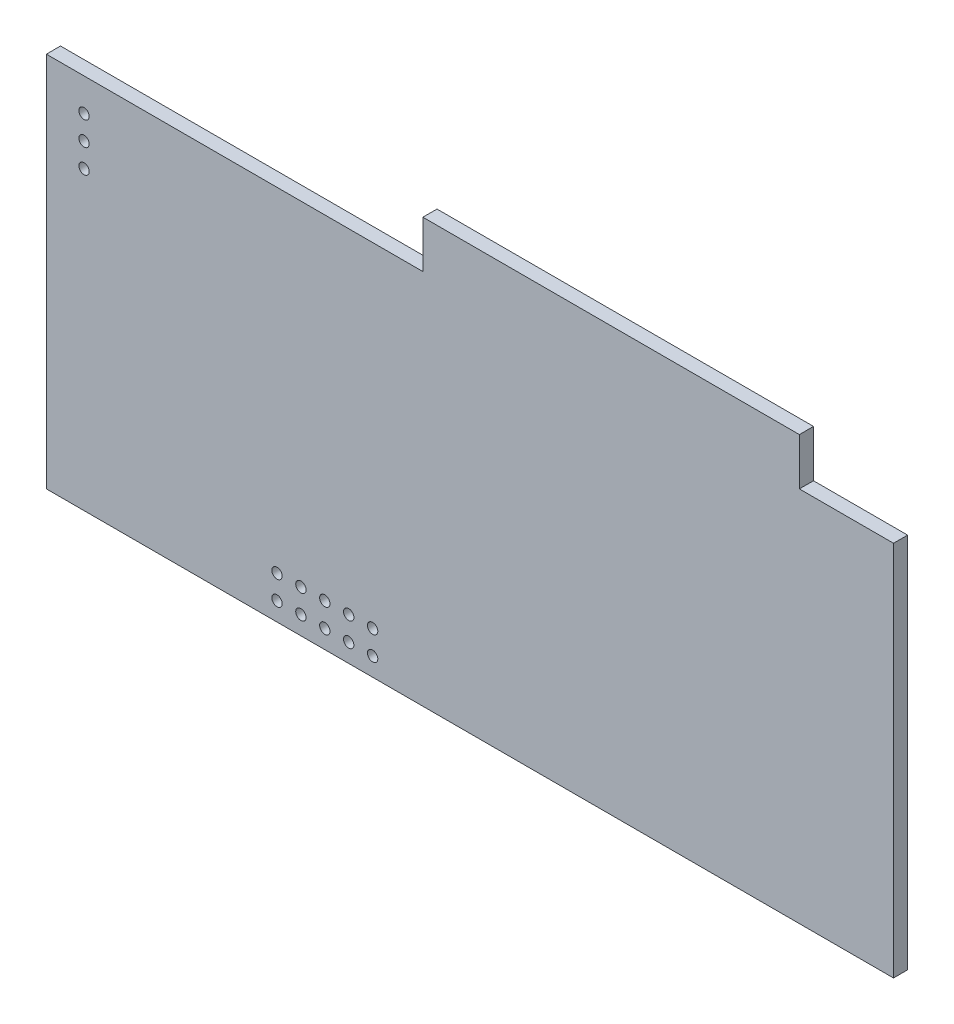
ISO-10303-21;
HEADER;
FILE_DESCRIPTION(('STEP AP214'),'2;1');
FILE_NAME('part.step','',(''),(''),'','','');
FILE_SCHEMA(('AUTOMOTIVE_DESIGN { 1 0 10303 214 1 1 1 1 }'));
ENDSEC;
DATA;
#1=APPLICATION_CONTEXT('core data for automotive mechanical design processes');
#2=APPLICATION_PROTOCOL_DEFINITION('international standard','automotive_design',2000,#1);
#3=PRODUCT_CONTEXT('',#1,'mechanical');
#4=PRODUCT('Part','Part','',(#3));
#5=PRODUCT_RELATED_PRODUCT_CATEGORY('part','',(#4));
#6=PRODUCT_DEFINITION_FORMATION('','',#4);
#7=PRODUCT_DEFINITION_CONTEXT('part definition',#1,'design');
#8=PRODUCT_DEFINITION('design','',#6,#7);
#9=PRODUCT_DEFINITION_SHAPE('','',#8);
#10=(LENGTH_UNIT() NAMED_UNIT(*) SI_UNIT(.MILLI.,.METRE.));
#11=(NAMED_UNIT(*) PLANE_ANGLE_UNIT() SI_UNIT($,.RADIAN.));
#12=(NAMED_UNIT(*) SI_UNIT($,.STERADIAN.) SOLID_ANGLE_UNIT());
#13=UNCERTAINTY_MEASURE_WITH_UNIT(LENGTH_MEASURE(1.E-05),#10,'distance_accuracy_value','');
#14=(GEOMETRIC_REPRESENTATION_CONTEXT(3) GLOBAL_UNCERTAINTY_ASSIGNED_CONTEXT((#13)) GLOBAL_UNIT_ASSIGNED_CONTEXT((#10,
#11,#12)) REPRESENTATION_CONTEXT('',''));
#15=CARTESIAN_POINT('',(0.,0.,0.));
#16=DIRECTION('',(0.,0.,1.));
#17=DIRECTION('',(1.,0.,0.));
#18=AXIS2_PLACEMENT_3D('',#15,#16,#17);
#19=CARTESIAN_POINT('',(-40.,-20.,1.5));
#20=DIRECTION('',(1.,0.,0.));
#21=DIRECTION('',(0.,0.,-1.));
#22=AXIS2_PLACEMENT_3D('',#19,#20,#21);
#23=PLANE('',#22);
#24=DIRECTION('',(0.,-1.,0.));
#25=VECTOR('',#24,1.);
#26=CARTESIAN_POINT('',(-40.,-20.,0.));
#27=LINE('',#26,#25);
#28=CARTESIAN_POINT('',(-40.,20.,0.));
#29=VERTEX_POINT('',#28);
#30=CARTESIAN_POINT('',(-40.,-20.,0.));
#31=VERTEX_POINT('',#30);
#32=EDGE_CURVE('E127',#29,#31,#27,.T.);
#33=ORIENTED_EDGE('',*,*,#32,.T.);
#34=DIRECTION('',(0.,0.,-1.));
#35=VECTOR('',#34,1.);
#36=CARTESIAN_POINT('',(-40.,-20.,1.5));
#37=LINE('',#36,#35);
#38=CARTESIAN_POINT('',(-40.,-20.,1.5));
#39=VERTEX_POINT('',#38);
#40=EDGE_CURVE('E11',#39,#31,#37,.T.);
#41=ORIENTED_EDGE('',*,*,#40,.F.);
#42=DIRECTION('',(0.,-1.,0.));
#43=VECTOR('',#42,1.);
#44=CARTESIAN_POINT('',(-40.,-20.,1.5));
#45=LINE('',#44,#43);
#46=CARTESIAN_POINT('',(-40.,20.,1.5));
#47=VERTEX_POINT('',#46);
#48=EDGE_CURVE('E142',#47,#39,#45,.T.);
#49=ORIENTED_EDGE('',*,*,#48,.F.);
#50=DIRECTION('',(0.,0.,-1.));
#51=VECTOR('',#50,1.);
#52=CARTESIAN_POINT('',(-40.,20.,1.5));
#53=LINE('',#52,#51);
#54=EDGE_CURVE('E123',#47,#29,#53,.T.);
#55=ORIENTED_EDGE('',*,*,#54,.T.);
#56=EDGE_LOOP('',(#33,#41,#49,#55));
#57=FACE_BOUND('',#56,.T.);
#58=ADVANCED_FACE('F31',(#57),#23,.F.);
#59=CARTESIAN_POINT('',(-40.,-20.,1.5));
#60=DIRECTION('',(0.,1.,0.));
#61=DIRECTION('',(0.,0.,1.));
#62=AXIS2_PLACEMENT_3D('',#59,#60,#61);
#63=PLANE('',#62);
#64=DIRECTION('',(1.,0.,0.));
#65=VECTOR('',#64,1.);
#66=CARTESIAN_POINT('',(-40.,-20.,0.));
#67=LINE('',#66,#65);
#68=CARTESIAN_POINT('',(50.,-20.,0.));
#69=VERTEX_POINT('',#68);
#70=EDGE_CURVE('E130',#31,#69,#67,.T.);
#71=ORIENTED_EDGE('',*,*,#70,.T.);
#72=DIRECTION('',(0.,0.,-1.));
#73=VECTOR('',#72,1.);
#74=CARTESIAN_POINT('',(50.,-20.,1.5));
#75=LINE('',#74,#73);
#76=CARTESIAN_POINT('',(50.,-20.,1.5));
#77=VERTEX_POINT('',#76);
#78=EDGE_CURVE('E39',#77,#69,#75,.T.);
#79=ORIENTED_EDGE('',*,*,#78,.F.);
#80=DIRECTION('',(1.,0.,0.));
#81=VECTOR('',#80,1.);
#82=CARTESIAN_POINT('',(-40.,-20.,1.5));
#83=LINE('',#82,#81);
#84=EDGE_CURVE('E90',#39,#77,#83,.T.);
#85=ORIENTED_EDGE('',*,*,#84,.F.);
#86=ORIENTED_EDGE('',*,*,#40,.T.);
#87=EDGE_LOOP('',(#71,#79,#85,#86));
#88=FACE_BOUND('',#87,.T.);
#89=ADVANCED_FACE('F305',(#88),#63,.F.);
#90=CARTESIAN_POINT('',(50.,-20.,1.5));
#91=DIRECTION('',(-1.,0.,0.));
#92=DIRECTION('',(0.,0.,1.));
#93=AXIS2_PLACEMENT_3D('',#90,#91,#92);
#94=PLANE('',#93);
#95=DIRECTION('',(0.,1.,0.));
#96=VECTOR('',#95,1.);
#97=CARTESIAN_POINT('',(50.,-20.,0.));
#98=LINE('',#97,#96);
#99=CARTESIAN_POINT('',(50.,20.,0.));
#100=VERTEX_POINT('',#99);
#101=EDGE_CURVE('E133',#69,#100,#98,.T.);
#102=ORIENTED_EDGE('',*,*,#101,.T.);
#103=DIRECTION('',(0.,0.,-1.));
#104=VECTOR('',#103,1.);
#105=CARTESIAN_POINT('',(50.,20.,1.5));
#106=LINE('',#105,#104);
#107=CARTESIAN_POINT('',(50.,20.,1.5));
#108=VERTEX_POINT('',#107);
#109=EDGE_CURVE('E149',#108,#100,#106,.T.);
#110=ORIENTED_EDGE('',*,*,#109,.F.);
#111=DIRECTION('',(0.,1.,0.));
#112=VECTOR('',#111,1.);
#113=CARTESIAN_POINT('',(50.,-20.,1.5));
#114=LINE('',#113,#112);
#115=EDGE_CURVE('E157',#77,#108,#114,.T.);
#116=ORIENTED_EDGE('',*,*,#115,.F.);
#117=ORIENTED_EDGE('',*,*,#78,.T.);
#118=EDGE_LOOP('',(#102,#110,#116,#117));
#119=FACE_BOUND('',#118,.T.);
#120=ADVANCED_FACE('F155',(#119),#94,.F.);
#121=CARTESIAN_POINT('',(40.,20.,1.5));
#122=DIRECTION('',(0.,-1.,0.));
#123=DIRECTION('',(0.,0.,-1.));
#124=AXIS2_PLACEMENT_3D('',#121,#122,#123);
#125=PLANE('',#124);
#126=DIRECTION('',(-1.,0.,0.));
#127=VECTOR('',#126,1.);
#128=CARTESIAN_POINT('',(40.,20.,0.));
#129=LINE('',#128,#127);
#130=CARTESIAN_POINT('',(40.,20.,0.));
#131=VERTEX_POINT('',#130);
#132=EDGE_CURVE('E135',#100,#131,#129,.T.);
#133=ORIENTED_EDGE('',*,*,#132,.T.);
#134=DIRECTION('',(0.,0.,-1.));
#135=VECTOR('',#134,1.);
#136=CARTESIAN_POINT('',(40.,20.,1.5));
#137=LINE('',#136,#135);
#138=CARTESIAN_POINT('',(40.,20.,1.5));
#139=VERTEX_POINT('',#138);
#140=EDGE_CURVE('E146',#139,#131,#137,.T.);
#141=ORIENTED_EDGE('',*,*,#140,.F.);
#142=DIRECTION('',(-1.,0.,0.));
#143=VECTOR('',#142,1.);
#144=CARTESIAN_POINT('',(40.,20.,1.5));
#145=LINE('',#144,#143);
#146=EDGE_CURVE('E169',#108,#139,#145,.T.);
#147=ORIENTED_EDGE('',*,*,#146,.F.);
#148=ORIENTED_EDGE('',*,*,#109,.T.);
#149=EDGE_LOOP('',(#133,#141,#147,#148));
#150=FACE_BOUND('',#149,.T.);
#151=ADVANCED_FACE('F165',(#150),#125,.F.);
#152=CARTESIAN_POINT('',(40.,25.,1.5));
#153=DIRECTION('',(-1.,0.,0.));
#154=DIRECTION('',(0.,0.,1.));
#155=AXIS2_PLACEMENT_3D('',#152,#153,#154);
#156=PLANE('',#155);
#157=DIRECTION('',(0.,1.,0.));
#158=VECTOR('',#157,1.);
#159=CARTESIAN_POINT('',(40.,25.,0.));
#160=LINE('',#159,#158);
#161=CARTESIAN_POINT('',(40.,25.,0.));
#162=VERTEX_POINT('',#161);
#163=EDGE_CURVE('E137',#131,#162,#160,.T.);
#164=ORIENTED_EDGE('',*,*,#163,.T.);
#165=DIRECTION('',(0.,0.,-1.));
#166=VECTOR('',#165,1.);
#167=CARTESIAN_POINT('',(40.,25.,1.5));
#168=LINE('',#167,#166);
#169=CARTESIAN_POINT('',(40.,25.,1.5));
#170=VERTEX_POINT('',#169);
#171=EDGE_CURVE('E118',#170,#162,#168,.T.);
#172=ORIENTED_EDGE('',*,*,#171,.F.);
#173=DIRECTION('',(0.,1.,0.));
#174=VECTOR('',#173,1.);
#175=CARTESIAN_POINT('',(40.,25.,1.5));
#176=LINE('',#175,#174);
#177=EDGE_CURVE('E109',#139,#170,#176,.T.);
#178=ORIENTED_EDGE('',*,*,#177,.F.);
#179=ORIENTED_EDGE('',*,*,#140,.T.);
#180=EDGE_LOOP('',(#164,#172,#178,#179));
#181=FACE_BOUND('',#180,.T.);
#182=ADVANCED_FACE('F168',(#181),#156,.F.);
#183=CARTESIAN_POINT('',(0.,25.,1.5));
#184=DIRECTION('',(0.,-1.,0.));
#185=DIRECTION('',(0.,0.,-1.));
#186=AXIS2_PLACEMENT_3D('',#183,#184,#185);
#187=PLANE('',#186);
#188=DIRECTION('',(-1.,0.,0.));
#189=VECTOR('',#188,1.);
#190=CARTESIAN_POINT('',(0.,25.,0.));
#191=LINE('',#190,#189);
#192=CARTESIAN_POINT('',(0.,25.,0.));
#193=VERTEX_POINT('',#192);
#194=EDGE_CURVE('E117',#162,#193,#191,.T.);
#195=ORIENTED_EDGE('',*,*,#194,.T.);
#196=DIRECTION('',(0.,0.,-1.));
#197=VECTOR('',#196,1.);
#198=CARTESIAN_POINT('',(0.,25.,1.5));
#199=LINE('',#198,#197);
#200=CARTESIAN_POINT('',(0.,25.,1.5));
#201=VERTEX_POINT('',#200);
#202=EDGE_CURVE('E114',#201,#193,#199,.T.);
#203=ORIENTED_EDGE('',*,*,#202,.F.);
#204=DIRECTION('',(-1.,0.,0.));
#205=VECTOR('',#204,1.);
#206=CARTESIAN_POINT('',(0.,25.,1.5));
#207=LINE('',#206,#205);
#208=EDGE_CURVE('E103',#170,#201,#207,.T.);
#209=ORIENTED_EDGE('',*,*,#208,.F.);
#210=ORIENTED_EDGE('',*,*,#171,.T.);
#211=EDGE_LOOP('',(#195,#203,#209,#210));
#212=FACE_BOUND('',#211,.T.);
#213=ADVANCED_FACE('F115',(#212),#187,.F.);
#214=CARTESIAN_POINT('',(0.,20.,1.5));
#215=DIRECTION('',(1.,0.,0.));
#216=DIRECTION('',(0.,0.,-1.));
#217=AXIS2_PLACEMENT_3D('',#214,#215,#216);
#218=PLANE('',#217);
#219=DIRECTION('',(0.,-1.,0.));
#220=VECTOR('',#219,1.);
#221=CARTESIAN_POINT('',(0.,20.,0.));
#222=LINE('',#221,#220);
#223=CARTESIAN_POINT('',(0.,20.,0.));
#224=VERTEX_POINT('',#223);
#225=EDGE_CURVE('E76',#193,#224,#222,.T.);
#226=ORIENTED_EDGE('',*,*,#225,.T.);
#227=DIRECTION('',(0.,0.,-1.));
#228=VECTOR('',#227,1.);
#229=CARTESIAN_POINT('',(0.,20.,1.5));
#230=LINE('',#229,#228);
#231=CARTESIAN_POINT('',(0.,20.,1.5));
#232=VERTEX_POINT('',#231);
#233=EDGE_CURVE('E119',#232,#224,#230,.T.);
#234=ORIENTED_EDGE('',*,*,#233,.F.);
#235=DIRECTION('',(0.,-1.,0.));
#236=VECTOR('',#235,1.);
#237=CARTESIAN_POINT('',(0.,20.,1.5));
#238=LINE('',#237,#236);
#239=EDGE_CURVE('E107',#201,#232,#238,.T.);
#240=ORIENTED_EDGE('',*,*,#239,.F.);
#241=ORIENTED_EDGE('',*,*,#202,.T.);
#242=EDGE_LOOP('',(#226,#234,#240,#241));
#243=FACE_BOUND('',#242,.T.);
#244=ADVANCED_FACE('F121',(#243),#218,.F.);
#245=CARTESIAN_POINT('',(-40.,20.,1.5));
#246=DIRECTION('',(0.,-1.,0.));
#247=DIRECTION('',(0.,0.,-1.));
#248=AXIS2_PLACEMENT_3D('',#245,#246,#247);
#249=PLANE('',#248);
#250=DIRECTION('',(-1.,0.,0.));
#251=VECTOR('',#250,1.);
#252=CARTESIAN_POINT('',(-40.,20.,0.));
#253=LINE('',#252,#251);
#254=EDGE_CURVE('E82',#224,#29,#253,.T.);
#255=ORIENTED_EDGE('',*,*,#254,.T.);
#256=ORIENTED_EDGE('',*,*,#54,.F.);
#257=DIRECTION('',(-1.,0.,0.));
#258=VECTOR('',#257,1.);
#259=CARTESIAN_POINT('',(-40.,20.,1.5));
#260=LINE('',#259,#258);
#261=EDGE_CURVE('E47',#232,#47,#260,.T.);
#262=ORIENTED_EDGE('',*,*,#261,.F.);
#263=ORIENTED_EDGE('',*,*,#233,.T.);
#264=EDGE_LOOP('',(#255,#256,#262,#263));
#265=FACE_BOUND('',#264,.T.);
#266=ADVANCED_FACE('F264',(#265),#249,.F.);
#267=CARTESIAN_POINT('',(-40.,20.,1.5));
#268=DIRECTION('',(0.,0.,-1.));
#269=DIRECTION('',(-1.,0.,0.));
#270=AXIS2_PLACEMENT_3D('',#267,#268,#269);
#271=PLANE('',#270);
#272=CARTESIAN_POINT('',(-5.34,-18.04,1.5));
#273=DIRECTION('',(0.,0.,1.));
#274=DIRECTION('',(1.,0.,0.));
#275=AXIS2_PLACEMENT_3D('',#272,#273,#274);
#276=CIRCLE('',#275,0.549999999999999);
#277=CARTESIAN_POINT('',(-4.79,-18.04,1.5));
#278=VERTEX_POINT('',#277);
#279=EDGE_CURVE('E247',#278,#278,#276,.T.);
#280=ORIENTED_EDGE('',*,*,#279,.F.);
#281=EDGE_LOOP('',(#280));
#282=FACE_BOUND('',#281,.T.);
#283=CARTESIAN_POINT('',(-5.34,-15.5,1.5));
#284=DIRECTION('',(0.,0.,1.));
#285=DIRECTION('',(1.,0.,0.));
#286=AXIS2_PLACEMENT_3D('',#283,#284,#285);
#287=CIRCLE('',#286,0.55);
#288=CARTESIAN_POINT('',(-4.79,-15.5,1.5));
#289=VERTEX_POINT('',#288);
#290=EDGE_CURVE('E241',#289,#289,#287,.T.);
#291=ORIENTED_EDGE('',*,*,#290,.F.);
#292=EDGE_LOOP('',(#291));
#293=FACE_BOUND('',#292,.T.);
#294=CARTESIAN_POINT('',(-7.88,-18.04,1.5));
#295=DIRECTION('',(0.,0.,1.));
#296=DIRECTION('',(1.,0.,0.));
#297=AXIS2_PLACEMENT_3D('',#294,#295,#296);
#298=CIRCLE('',#297,0.549999999999999);
#299=CARTESIAN_POINT('',(-7.33,-18.04,1.5));
#300=VERTEX_POINT('',#299);
#301=EDGE_CURVE('E235',#300,#300,#298,.T.);
#302=ORIENTED_EDGE('',*,*,#301,.F.);
#303=EDGE_LOOP('',(#302));
#304=FACE_BOUND('',#303,.T.);
#305=CARTESIAN_POINT('',(-7.88,-15.5,1.5));
#306=DIRECTION('',(0.,0.,1.));
#307=DIRECTION('',(1.,0.,0.));
#308=AXIS2_PLACEMENT_3D('',#305,#306,#307);
#309=CIRCLE('',#308,0.55);
#310=CARTESIAN_POINT('',(-7.33,-15.5,1.5));
#311=VERTEX_POINT('',#310);
#312=EDGE_CURVE('E229',#311,#311,#309,.T.);
#313=ORIENTED_EDGE('',*,*,#312,.F.);
#314=EDGE_LOOP('',(#313));
#315=FACE_BOUND('',#314,.T.);
#316=CARTESIAN_POINT('',(-10.42,-18.04,1.5));
#317=DIRECTION('',(0.,0.,1.));
#318=DIRECTION('',(1.,0.,0.));
#319=AXIS2_PLACEMENT_3D('',#316,#317,#318);
#320=CIRCLE('',#319,0.549999999999999);
#321=CARTESIAN_POINT('',(-9.87,-18.04,1.5));
#322=VERTEX_POINT('',#321);
#323=EDGE_CURVE('E223',#322,#322,#320,.T.);
#324=ORIENTED_EDGE('',*,*,#323,.F.);
#325=EDGE_LOOP('',(#324));
#326=FACE_BOUND('',#325,.T.);
#327=CARTESIAN_POINT('',(-10.42,-15.5,1.5));
#328=DIRECTION('',(0.,0.,1.));
#329=DIRECTION('',(1.,0.,0.));
#330=AXIS2_PLACEMENT_3D('',#327,#328,#329);
#331=CIRCLE('',#330,0.55);
#332=CARTESIAN_POINT('',(-9.87,-15.5,1.5));
#333=VERTEX_POINT('',#332);
#334=EDGE_CURVE('E217',#333,#333,#331,.T.);
#335=ORIENTED_EDGE('',*,*,#334,.F.);
#336=EDGE_LOOP('',(#335));
#337=FACE_BOUND('',#336,.T.);
#338=CARTESIAN_POINT('',(-12.96,-18.04,1.5));
#339=DIRECTION('',(0.,0.,1.));
#340=DIRECTION('',(1.,0.,0.));
#341=AXIS2_PLACEMENT_3D('',#338,#339,#340);
#342=CIRCLE('',#341,0.549999999999999);
#343=CARTESIAN_POINT('',(-12.41,-18.04,1.5));
#344=VERTEX_POINT('',#343);
#345=EDGE_CURVE('E211',#344,#344,#342,.T.);
#346=ORIENTED_EDGE('',*,*,#345,.F.);
#347=EDGE_LOOP('',(#346));
#348=FACE_BOUND('',#347,.T.);
#349=CARTESIAN_POINT('',(-12.96,-15.5,1.5));
#350=DIRECTION('',(0.,0.,1.));
#351=DIRECTION('',(1.,0.,0.));
#352=AXIS2_PLACEMENT_3D('',#349,#350,#351);
#353=CIRCLE('',#352,0.55);
#354=CARTESIAN_POINT('',(-12.41,-15.5,1.5));
#355=VERTEX_POINT('',#354);
#356=EDGE_CURVE('E205',#355,#355,#353,.T.);
#357=ORIENTED_EDGE('',*,*,#356,.F.);
#358=EDGE_LOOP('',(#357));
#359=FACE_BOUND('',#358,.T.);
#360=CARTESIAN_POINT('',(-15.5,-18.04,1.5));
#361=DIRECTION('',(0.,0.,1.));
#362=DIRECTION('',(1.,0.,0.));
#363=AXIS2_PLACEMENT_3D('',#360,#361,#362);
#364=CIRCLE('',#363,0.549999999999999);
#365=CARTESIAN_POINT('',(-14.95,-18.04,1.5));
#366=VERTEX_POINT('',#365);
#367=EDGE_CURVE('E199',#366,#366,#364,.T.);
#368=ORIENTED_EDGE('',*,*,#367,.F.);
#369=EDGE_LOOP('',(#368));
#370=FACE_BOUND('',#369,.T.);
#371=CARTESIAN_POINT('',(-15.5,-15.5,1.5));
#372=DIRECTION('',(0.,0.,1.));
#373=DIRECTION('',(1.,0.,0.));
#374=AXIS2_PLACEMENT_3D('',#371,#372,#373);
#375=CIRCLE('',#374,0.55);
#376=CARTESIAN_POINT('',(-14.95,-15.5,1.5));
#377=VERTEX_POINT('',#376);
#378=EDGE_CURVE('E193',#377,#377,#375,.T.);
#379=ORIENTED_EDGE('',*,*,#378,.F.);
#380=EDGE_LOOP('',(#379));
#381=FACE_BOUND('',#380,.T.);
#382=CARTESIAN_POINT('',(-36.,14.,1.5));
#383=DIRECTION('',(0.,0.,1.));
#384=DIRECTION('',(1.,0.,0.));
#385=AXIS2_PLACEMENT_3D('',#382,#383,#384);
#386=CIRCLE('',#385,0.550000000000003);
#387=CARTESIAN_POINT('',(-35.45,14.,1.5));
#388=VERTEX_POINT('',#387);
#389=EDGE_CURVE('E187',#388,#388,#386,.T.);
#390=ORIENTED_EDGE('',*,*,#389,.F.);
#391=EDGE_LOOP('',(#390));
#392=FACE_BOUND('',#391,.T.);
#393=CARTESIAN_POINT('',(-36.,11.46,1.5));
#394=DIRECTION('',(0.,0.,1.));
#395=DIRECTION('',(1.,0.,0.));
#396=AXIS2_PLACEMENT_3D('',#393,#394,#395);
#397=CIRCLE('',#396,0.550000000000003);
#398=CARTESIAN_POINT('',(-35.45,11.46,1.5));
#399=VERTEX_POINT('',#398);
#400=EDGE_CURVE('E181',#399,#399,#397,.T.);
#401=ORIENTED_EDGE('',*,*,#400,.F.);
#402=EDGE_LOOP('',(#401));
#403=FACE_BOUND('',#402,.T.);
#404=CARTESIAN_POINT('',(-36.,16.54,1.5));
#405=DIRECTION('',(0.,0.,1.));
#406=DIRECTION('',(1.,0.,0.));
#407=AXIS2_PLACEMENT_3D('',#404,#405,#406);
#408=CIRCLE('',#407,0.550000000000003);
#409=CARTESIAN_POINT('',(-35.45,16.54,1.5));
#410=VERTEX_POINT('',#409);
#411=EDGE_CURVE('E175',#410,#410,#408,.T.);
#412=ORIENTED_EDGE('',*,*,#411,.F.);
#413=EDGE_LOOP('',(#412));
#414=FACE_BOUND('',#413,.T.);
#415=ORIENTED_EDGE('',*,*,#48,.T.);
#416=ORIENTED_EDGE('',*,*,#84,.T.);
#417=ORIENTED_EDGE('',*,*,#115,.T.);
#418=ORIENTED_EDGE('',*,*,#146,.T.);
#419=ORIENTED_EDGE('',*,*,#177,.T.);
#420=ORIENTED_EDGE('',*,*,#208,.T.);
#421=ORIENTED_EDGE('',*,*,#239,.T.);
#422=ORIENTED_EDGE('',*,*,#261,.T.);
#423=EDGE_LOOP('',(#415,#416,#417,#418,#419,#420,#421,#422));
#424=FACE_BOUND('',#423,.T.);
#425=ADVANCED_FACE('F105',(#282,#293,#304,#315,#326,#337,#348,#359,#370,#381,#392,#403,#414,
#424),#271,.F.);
#426=CARTESIAN_POINT('',(-40.,20.,0.));
#427=DIRECTION('',(0.,0.,-1.));
#428=DIRECTION('',(-1.,0.,0.));
#429=AXIS2_PLACEMENT_3D('',#426,#427,#428);
#430=PLANE('',#429);
#431=CARTESIAN_POINT('',(-5.34,-18.04,0.));
#432=DIRECTION('',(0.,0.,1.));
#433=DIRECTION('',(1.,0.,0.));
#434=AXIS2_PLACEMENT_3D('',#431,#432,#433);
#435=CIRCLE('',#434,0.549999999999999);
#436=CARTESIAN_POINT('',(-4.79,-18.04,0.));
#437=VERTEX_POINT('',#436);
#438=EDGE_CURVE('E244',#437,#437,#435,.T.);
#439=ORIENTED_EDGE('',*,*,#438,.T.);
#440=EDGE_LOOP('',(#439));
#441=FACE_BOUND('',#440,.T.);
#442=CARTESIAN_POINT('',(-5.34,-15.5,0.));
#443=DIRECTION('',(0.,0.,1.));
#444=DIRECTION('',(1.,0.,0.));
#445=AXIS2_PLACEMENT_3D('',#442,#443,#444);
#446=CIRCLE('',#445,0.55);
#447=CARTESIAN_POINT('',(-4.79,-15.5,0.));
#448=VERTEX_POINT('',#447);
#449=EDGE_CURVE('E238',#448,#448,#446,.T.);
#450=ORIENTED_EDGE('',*,*,#449,.T.);
#451=EDGE_LOOP('',(#450));
#452=FACE_BOUND('',#451,.T.);
#453=CARTESIAN_POINT('',(-7.88,-18.04,0.));
#454=DIRECTION('',(0.,0.,1.));
#455=DIRECTION('',(1.,0.,0.));
#456=AXIS2_PLACEMENT_3D('',#453,#454,#455);
#457=CIRCLE('',#456,0.549999999999999);
#458=CARTESIAN_POINT('',(-7.33,-18.04,0.));
#459=VERTEX_POINT('',#458);
#460=EDGE_CURVE('E232',#459,#459,#457,.T.);
#461=ORIENTED_EDGE('',*,*,#460,.T.);
#462=EDGE_LOOP('',(#461));
#463=FACE_BOUND('',#462,.T.);
#464=CARTESIAN_POINT('',(-7.88,-15.5,0.));
#465=DIRECTION('',(0.,0.,1.));
#466=DIRECTION('',(1.,0.,0.));
#467=AXIS2_PLACEMENT_3D('',#464,#465,#466);
#468=CIRCLE('',#467,0.55);
#469=CARTESIAN_POINT('',(-7.33,-15.5,0.));
#470=VERTEX_POINT('',#469);
#471=EDGE_CURVE('E226',#470,#470,#468,.T.);
#472=ORIENTED_EDGE('',*,*,#471,.T.);
#473=EDGE_LOOP('',(#472));
#474=FACE_BOUND('',#473,.T.);
#475=CARTESIAN_POINT('',(-10.42,-18.04,0.));
#476=DIRECTION('',(0.,0.,1.));
#477=DIRECTION('',(1.,0.,0.));
#478=AXIS2_PLACEMENT_3D('',#475,#476,#477);
#479=CIRCLE('',#478,0.549999999999999);
#480=CARTESIAN_POINT('',(-9.87,-18.04,0.));
#481=VERTEX_POINT('',#480);
#482=EDGE_CURVE('E220',#481,#481,#479,.T.);
#483=ORIENTED_EDGE('',*,*,#482,.T.);
#484=EDGE_LOOP('',(#483));
#485=FACE_BOUND('',#484,.T.);
#486=CARTESIAN_POINT('',(-10.42,-15.5,0.));
#487=DIRECTION('',(0.,0.,1.));
#488=DIRECTION('',(1.,0.,0.));
#489=AXIS2_PLACEMENT_3D('',#486,#487,#488);
#490=CIRCLE('',#489,0.55);
#491=CARTESIAN_POINT('',(-9.87,-15.5,0.));
#492=VERTEX_POINT('',#491);
#493=EDGE_CURVE('E214',#492,#492,#490,.T.);
#494=ORIENTED_EDGE('',*,*,#493,.T.);
#495=EDGE_LOOP('',(#494));
#496=FACE_BOUND('',#495,.T.);
#497=CARTESIAN_POINT('',(-12.96,-18.04,0.));
#498=DIRECTION('',(0.,0.,1.));
#499=DIRECTION('',(1.,0.,0.));
#500=AXIS2_PLACEMENT_3D('',#497,#498,#499);
#501=CIRCLE('',#500,0.549999999999999);
#502=CARTESIAN_POINT('',(-12.41,-18.04,0.));
#503=VERTEX_POINT('',#502);
#504=EDGE_CURVE('E208',#503,#503,#501,.T.);
#505=ORIENTED_EDGE('',*,*,#504,.T.);
#506=EDGE_LOOP('',(#505));
#507=FACE_BOUND('',#506,.T.);
#508=CARTESIAN_POINT('',(-12.96,-15.5,0.));
#509=DIRECTION('',(0.,0.,1.));
#510=DIRECTION('',(1.,0.,0.));
#511=AXIS2_PLACEMENT_3D('',#508,#509,#510);
#512=CIRCLE('',#511,0.55);
#513=CARTESIAN_POINT('',(-12.41,-15.5,0.));
#514=VERTEX_POINT('',#513);
#515=EDGE_CURVE('E202',#514,#514,#512,.T.);
#516=ORIENTED_EDGE('',*,*,#515,.T.);
#517=EDGE_LOOP('',(#516));
#518=FACE_BOUND('',#517,.T.);
#519=CARTESIAN_POINT('',(-15.5,-18.04,0.));
#520=DIRECTION('',(0.,0.,1.));
#521=DIRECTION('',(1.,0.,0.));
#522=AXIS2_PLACEMENT_3D('',#519,#520,#521);
#523=CIRCLE('',#522,0.549999999999999);
#524=CARTESIAN_POINT('',(-14.95,-18.04,0.));
#525=VERTEX_POINT('',#524);
#526=EDGE_CURVE('E196',#525,#525,#523,.T.);
#527=ORIENTED_EDGE('',*,*,#526,.T.);
#528=EDGE_LOOP('',(#527));
#529=FACE_BOUND('',#528,.T.);
#530=CARTESIAN_POINT('',(-15.5,-15.5,0.));
#531=DIRECTION('',(0.,0.,1.));
#532=DIRECTION('',(1.,0.,0.));
#533=AXIS2_PLACEMENT_3D('',#530,#531,#532);
#534=CIRCLE('',#533,0.55);
#535=CARTESIAN_POINT('',(-14.95,-15.5,0.));
#536=VERTEX_POINT('',#535);
#537=EDGE_CURVE('E190',#536,#536,#534,.T.);
#538=ORIENTED_EDGE('',*,*,#537,.T.);
#539=EDGE_LOOP('',(#538));
#540=FACE_BOUND('',#539,.T.);
#541=CARTESIAN_POINT('',(-36.,14.,0.));
#542=DIRECTION('',(0.,0.,1.));
#543=DIRECTION('',(1.,0.,0.));
#544=AXIS2_PLACEMENT_3D('',#541,#542,#543);
#545=CIRCLE('',#544,0.550000000000003);
#546=CARTESIAN_POINT('',(-35.45,14.,0.));
#547=VERTEX_POINT('',#546);
#548=EDGE_CURVE('E184',#547,#547,#545,.T.);
#549=ORIENTED_EDGE('',*,*,#548,.T.);
#550=EDGE_LOOP('',(#549));
#551=FACE_BOUND('',#550,.T.);
#552=CARTESIAN_POINT('',(-36.,11.46,0.));
#553=DIRECTION('',(0.,0.,1.));
#554=DIRECTION('',(1.,0.,0.));
#555=AXIS2_PLACEMENT_3D('',#552,#553,#554);
#556=CIRCLE('',#555,0.550000000000003);
#557=CARTESIAN_POINT('',(-35.45,11.46,0.));
#558=VERTEX_POINT('',#557);
#559=EDGE_CURVE('E178',#558,#558,#556,.T.);
#560=ORIENTED_EDGE('',*,*,#559,.T.);
#561=EDGE_LOOP('',(#560));
#562=FACE_BOUND('',#561,.T.);
#563=CARTESIAN_POINT('',(-36.,16.54,0.));
#564=DIRECTION('',(0.,0.,1.));
#565=DIRECTION('',(1.,0.,0.));
#566=AXIS2_PLACEMENT_3D('',#563,#564,#565);
#567=CIRCLE('',#566,0.550000000000003);
#568=CARTESIAN_POINT('',(-35.45,16.54,0.));
#569=VERTEX_POINT('',#568);
#570=EDGE_CURVE('E131',#569,#569,#567,.T.);
#571=ORIENTED_EDGE('',*,*,#570,.T.);
#572=EDGE_LOOP('',(#571));
#573=FACE_BOUND('',#572,.T.);
#574=ORIENTED_EDGE('',*,*,#32,.F.);
#575=ORIENTED_EDGE('',*,*,#254,.F.);
#576=ORIENTED_EDGE('',*,*,#225,.F.);
#577=ORIENTED_EDGE('',*,*,#194,.F.);
#578=ORIENTED_EDGE('',*,*,#163,.F.);
#579=ORIENTED_EDGE('',*,*,#132,.F.);
#580=ORIENTED_EDGE('',*,*,#101,.F.);
#581=ORIENTED_EDGE('',*,*,#70,.F.);
#582=EDGE_LOOP('',(#574,#575,#576,#577,#578,#579,#580,#581));
#583=FACE_BOUND('',#582,.T.);
#584=ADVANCED_FACE('F161',(#441,#452,#463,#474,#485,#496,#507,#518,#529,#540,#551,#562,#573,
#583),#430,.T.);
#585=CARTESIAN_POINT('',(-36.,16.54,0.));
#586=DIRECTION('',(0.,0.,1.));
#587=DIRECTION('',(1.,0.,0.));
#588=AXIS2_PLACEMENT_3D('',#585,#586,#587);
#589=CYLINDRICAL_SURFACE('',#588,0.550000000000003);
#590=ORIENTED_EDGE('',*,*,#570,.F.);
#591=EDGE_LOOP('',(#590));
#592=FACE_BOUND('',#591,.T.);
#593=ORIENTED_EDGE('',*,*,#411,.T.);
#594=EDGE_LOOP('',(#593));
#595=FACE_BOUND('',#594,.T.);
#596=ADVANCED_FACE('F290',(#592,#595),#589,.F.);
#597=CARTESIAN_POINT('',(-36.,11.46,0.));
#598=DIRECTION('',(0.,0.,1.));
#599=DIRECTION('',(1.,0.,0.));
#600=AXIS2_PLACEMENT_3D('',#597,#598,#599);
#601=CYLINDRICAL_SURFACE('',#600,0.550000000000003);
#602=ORIENTED_EDGE('',*,*,#559,.F.);
#603=EDGE_LOOP('',(#602));
#604=FACE_BOUND('',#603,.T.);
#605=ORIENTED_EDGE('',*,*,#400,.T.);
#606=EDGE_LOOP('',(#605));
#607=FACE_BOUND('',#606,.T.);
#608=ADVANCED_FACE('F292',(#604,#607),#601,.F.);
#609=CARTESIAN_POINT('',(-36.,14.,0.));
#610=DIRECTION('',(0.,0.,1.));
#611=DIRECTION('',(1.,0.,0.));
#612=AXIS2_PLACEMENT_3D('',#609,#610,#611);
#613=CYLINDRICAL_SURFACE('',#612,0.550000000000003);
#614=ORIENTED_EDGE('',*,*,#548,.F.);
#615=EDGE_LOOP('',(#614));
#616=FACE_BOUND('',#615,.T.);
#617=ORIENTED_EDGE('',*,*,#389,.T.);
#618=EDGE_LOOP('',(#617));
#619=FACE_BOUND('',#618,.T.);
#620=ADVANCED_FACE('F299',(#616,#619),#613,.F.);
#621=CARTESIAN_POINT('',(-15.5,-15.5,0.));
#622=DIRECTION('',(0.,0.,1.));
#623=DIRECTION('',(1.,0.,0.));
#624=AXIS2_PLACEMENT_3D('',#621,#622,#623);
#625=CYLINDRICAL_SURFACE('',#624,0.55);
#626=ORIENTED_EDGE('',*,*,#537,.F.);
#627=EDGE_LOOP('',(#626));
#628=FACE_BOUND('',#627,.T.);
#629=ORIENTED_EDGE('',*,*,#378,.T.);
#630=EDGE_LOOP('',(#629));
#631=FACE_BOUND('',#630,.T.);
#632=ADVANCED_FACE('F381',(#628,#631),#625,.F.);
#633=CARTESIAN_POINT('',(-15.5,-18.04,0.));
#634=DIRECTION('',(0.,0.,1.));
#635=DIRECTION('',(1.,0.,0.));
#636=AXIS2_PLACEMENT_3D('',#633,#634,#635);
#637=CYLINDRICAL_SURFACE('',#636,0.549999999999999);
#638=ORIENTED_EDGE('',*,*,#526,.F.);
#639=EDGE_LOOP('',(#638));
#640=FACE_BOUND('',#639,.T.);
#641=ORIENTED_EDGE('',*,*,#367,.T.);
#642=EDGE_LOOP('',(#641));
#643=FACE_BOUND('',#642,.T.);
#644=ADVANCED_FACE('F391',(#640,#643),#637,.F.);
#645=CARTESIAN_POINT('',(-12.96,-15.5,0.));
#646=DIRECTION('',(0.,0.,1.));
#647=DIRECTION('',(1.,0.,0.));
#648=AXIS2_PLACEMENT_3D('',#645,#646,#647);
#649=CYLINDRICAL_SURFACE('',#648,0.55);
#650=ORIENTED_EDGE('',*,*,#515,.F.);
#651=EDGE_LOOP('',(#650));
#652=FACE_BOUND('',#651,.T.);
#653=ORIENTED_EDGE('',*,*,#356,.T.);
#654=EDGE_LOOP('',(#653));
#655=FACE_BOUND('',#654,.T.);
#656=ADVANCED_FACE('F401',(#652,#655),#649,.F.);
#657=CARTESIAN_POINT('',(-12.96,-18.04,0.));
#658=DIRECTION('',(0.,0.,1.));
#659=DIRECTION('',(1.,0.,0.));
#660=AXIS2_PLACEMENT_3D('',#657,#658,#659);
#661=CYLINDRICAL_SURFACE('',#660,0.549999999999999);
#662=ORIENTED_EDGE('',*,*,#504,.F.);
#663=EDGE_LOOP('',(#662));
#664=FACE_BOUND('',#663,.T.);
#665=ORIENTED_EDGE('',*,*,#345,.T.);
#666=EDGE_LOOP('',(#665));
#667=FACE_BOUND('',#666,.T.);
#668=ADVANCED_FACE('F411',(#664,#667),#661,.F.);
#669=CARTESIAN_POINT('',(-10.42,-15.5,0.));
#670=DIRECTION('',(0.,0.,1.));
#671=DIRECTION('',(1.,0.,0.));
#672=AXIS2_PLACEMENT_3D('',#669,#670,#671);
#673=CYLINDRICAL_SURFACE('',#672,0.55);
#674=ORIENTED_EDGE('',*,*,#493,.F.);
#675=EDGE_LOOP('',(#674));
#676=FACE_BOUND('',#675,.T.);
#677=ORIENTED_EDGE('',*,*,#334,.T.);
#678=EDGE_LOOP('',(#677));
#679=FACE_BOUND('',#678,.T.);
#680=ADVANCED_FACE('F421',(#676,#679),#673,.F.);
#681=CARTESIAN_POINT('',(-10.42,-18.04,0.));
#682=DIRECTION('',(0.,0.,1.));
#683=DIRECTION('',(1.,0.,0.));
#684=AXIS2_PLACEMENT_3D('',#681,#682,#683);
#685=CYLINDRICAL_SURFACE('',#684,0.549999999999999);
#686=ORIENTED_EDGE('',*,*,#482,.F.);
#687=EDGE_LOOP('',(#686));
#688=FACE_BOUND('',#687,.T.);
#689=ORIENTED_EDGE('',*,*,#323,.T.);
#690=EDGE_LOOP('',(#689));
#691=FACE_BOUND('',#690,.T.);
#692=ADVANCED_FACE('F431',(#688,#691),#685,.F.);
#693=CARTESIAN_POINT('',(-7.88,-15.5,0.));
#694=DIRECTION('',(0.,0.,1.));
#695=DIRECTION('',(1.,0.,0.));
#696=AXIS2_PLACEMENT_3D('',#693,#694,#695);
#697=CYLINDRICAL_SURFACE('',#696,0.55);
#698=ORIENTED_EDGE('',*,*,#471,.F.);
#699=EDGE_LOOP('',(#698));
#700=FACE_BOUND('',#699,.T.);
#701=ORIENTED_EDGE('',*,*,#312,.T.);
#702=EDGE_LOOP('',(#701));
#703=FACE_BOUND('',#702,.T.);
#704=ADVANCED_FACE('F441',(#700,#703),#697,.F.);
#705=CARTESIAN_POINT('',(-7.88,-18.04,0.));
#706=DIRECTION('',(0.,0.,1.));
#707=DIRECTION('',(1.,0.,0.));
#708=AXIS2_PLACEMENT_3D('',#705,#706,#707);
#709=CYLINDRICAL_SURFACE('',#708,0.549999999999999);
#710=ORIENTED_EDGE('',*,*,#460,.F.);
#711=EDGE_LOOP('',(#710));
#712=FACE_BOUND('',#711,.T.);
#713=ORIENTED_EDGE('',*,*,#301,.T.);
#714=EDGE_LOOP('',(#713));
#715=FACE_BOUND('',#714,.T.);
#716=ADVANCED_FACE('F451',(#712,#715),#709,.F.);
#717=CARTESIAN_POINT('',(-5.34,-15.5,0.));
#718=DIRECTION('',(0.,0.,1.));
#719=DIRECTION('',(1.,0.,0.));
#720=AXIS2_PLACEMENT_3D('',#717,#718,#719);
#721=CYLINDRICAL_SURFACE('',#720,0.55);
#722=ORIENTED_EDGE('',*,*,#449,.F.);
#723=EDGE_LOOP('',(#722));
#724=FACE_BOUND('',#723,.T.);
#725=ORIENTED_EDGE('',*,*,#290,.T.);
#726=EDGE_LOOP('',(#725));
#727=FACE_BOUND('',#726,.T.);
#728=ADVANCED_FACE('F258',(#724,#727),#721,.F.);
#729=CARTESIAN_POINT('',(-5.34,-18.04,0.));
#730=DIRECTION('',(0.,0.,1.));
#731=DIRECTION('',(1.,0.,0.));
#732=AXIS2_PLACEMENT_3D('',#729,#730,#731);
#733=CYLINDRICAL_SURFACE('',#732,0.549999999999999);
#734=ORIENTED_EDGE('',*,*,#438,.F.);
#735=EDGE_LOOP('',(#734));
#736=FACE_BOUND('',#735,.T.);
#737=ORIENTED_EDGE('',*,*,#279,.T.);
#738=EDGE_LOOP('',(#737));
#739=FACE_BOUND('',#738,.T.);
#740=ADVANCED_FACE('F255',(#736,#739),#733,.F.);
#741=CLOSED_SHELL('',(#58,#89,#120,#151,#182,#213,#244,#266,#425,#584,#596,#608,#620,#632,#644,
#656,#668,#680,#692,#704,#716,#728,#740));
#742=MANIFOLD_SOLID_BREP('B2',#741);
#743=ADVANCED_BREP_SHAPE_REPRESENTATION('',(#18,#742),#14);
#744=SHAPE_DEFINITION_REPRESENTATION(#9,#743);
ENDSEC;
END-ISO-10303-21;
